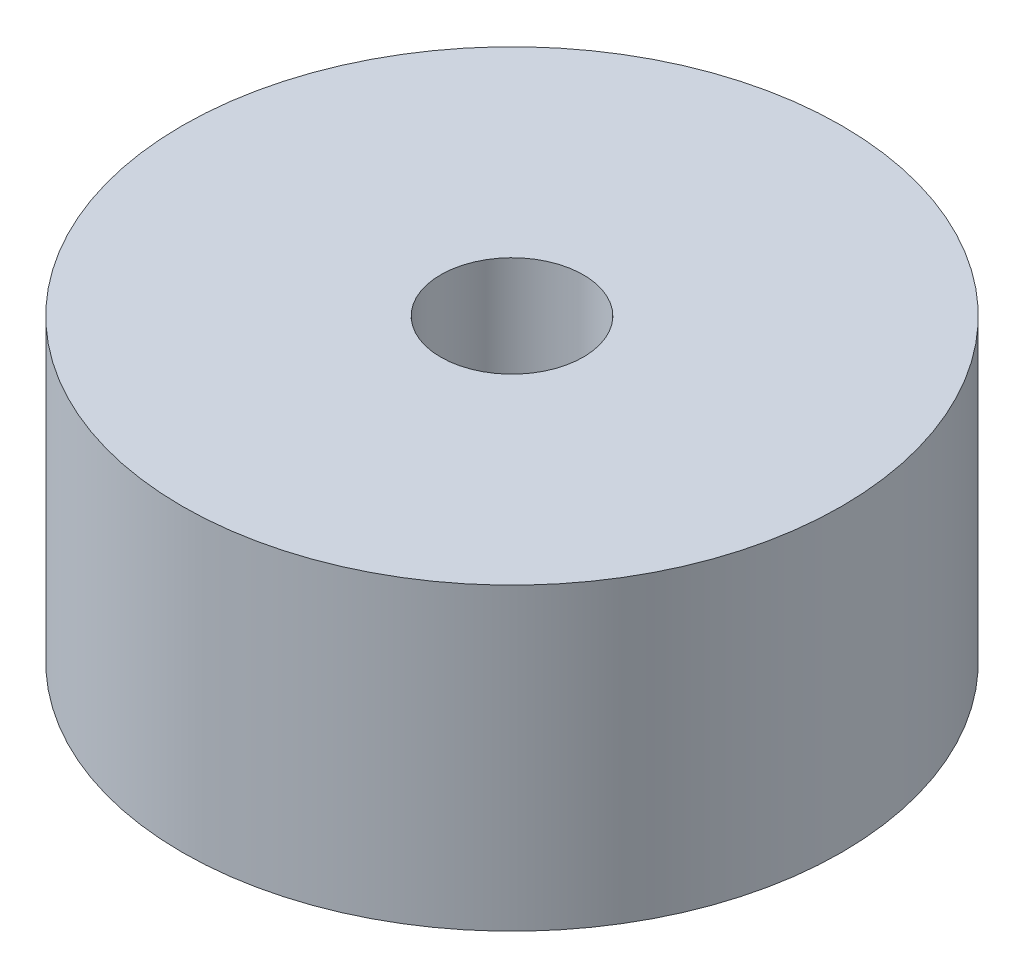
ISO-10303-21;
HEADER;
FILE_DESCRIPTION(('STEP AP214'),'2;1');
FILE_NAME('part.step','',(''),(''),'','','');
FILE_SCHEMA(('AUTOMOTIVE_DESIGN { 1 0 10303 214 1 1 1 1 }'));
ENDSEC;
DATA;
#1=APPLICATION_CONTEXT('core data for automotive mechanical design processes');
#2=APPLICATION_PROTOCOL_DEFINITION('international standard','automotive_design',2000,#1);
#3=PRODUCT_CONTEXT('',#1,'mechanical');
#4=PRODUCT('Part','Part','',(#3));
#5=PRODUCT_RELATED_PRODUCT_CATEGORY('part','',(#4));
#6=PRODUCT_DEFINITION_FORMATION('','',#4);
#7=PRODUCT_DEFINITION_CONTEXT('part definition',#1,'design');
#8=PRODUCT_DEFINITION('design','',#6,#7);
#9=PRODUCT_DEFINITION_SHAPE('','',#8);
#10=(LENGTH_UNIT() NAMED_UNIT(*) SI_UNIT(.MILLI.,.METRE.));
#11=(NAMED_UNIT(*) PLANE_ANGLE_UNIT() SI_UNIT($,.RADIAN.));
#12=(NAMED_UNIT(*) SI_UNIT($,.STERADIAN.) SOLID_ANGLE_UNIT());
#13=UNCERTAINTY_MEASURE_WITH_UNIT(LENGTH_MEASURE(1.E-05),#10,'distance_accuracy_value','');
#14=(GEOMETRIC_REPRESENTATION_CONTEXT(3) GLOBAL_UNCERTAINTY_ASSIGNED_CONTEXT((#13)) GLOBAL_UNIT_ASSIGNED_CONTEXT((#10,
#11,#12)) REPRESENTATION_CONTEXT('',''));
#15=CARTESIAN_POINT('',(0.,0.,0.));
#16=DIRECTION('',(0.,0.,1.));
#17=DIRECTION('',(1.,0.,0.));
#18=AXIS2_PLACEMENT_3D('',#15,#16,#17);
#19=CARTESIAN_POINT('',(0.,5.,0.));
#20=DIRECTION('',(0.,1.,0.));
#21=DIRECTION('',(0.,0.,1.));
#22=AXIS2_PLACEMENT_3D('',#19,#20,#21);
#23=PLANE('',#22);
#24=CARTESIAN_POINT('',(0.,5.,0.));
#25=DIRECTION('',(0.,1.,0.));
#26=DIRECTION('',(0.,0.,1.));
#27=AXIS2_PLACEMENT_3D('',#24,#25,#26);
#28=CIRCLE('',#27,5.5);
#29=CARTESIAN_POINT('',(0.,5.,5.5));
#30=VERTEX_POINT('',#29);
#31=EDGE_CURVE('E10',#30,#30,#28,.T.);
#32=ORIENTED_EDGE('',*,*,#31,.T.);
#33=EDGE_LOOP('',(#32));
#34=FACE_BOUND('',#33,.T.);
#35=CARTESIAN_POINT('',(0.,5.,0.));
#36=DIRECTION('',(0.,1.,0.));
#37=DIRECTION('',(0.,0.,1.));
#38=AXIS2_PLACEMENT_3D('',#35,#36,#37);
#39=CIRCLE('',#38,1.19);
#40=CARTESIAN_POINT('',(0.,5.,1.19));
#41=VERTEX_POINT('',#40);
#42=EDGE_CURVE('E42',#41,#41,#39,.T.);
#43=ORIENTED_EDGE('',*,*,#42,.F.);
#44=EDGE_LOOP('',(#43));
#45=FACE_BOUND('',#44,.T.);
#46=ADVANCED_FACE('F31',(#34,#45),#23,.T.);
#47=CARTESIAN_POINT('',(0.,0.,0.));
#48=DIRECTION('',(0.,1.,0.));
#49=DIRECTION('',(0.,0.,1.));
#50=AXIS2_PLACEMENT_3D('',#47,#48,#49);
#51=PLANE('',#50);
#52=CARTESIAN_POINT('',(0.,0.,0.));
#53=DIRECTION('',(0.,1.,0.));
#54=DIRECTION('',(0.,0.,1.));
#55=AXIS2_PLACEMENT_3D('',#52,#53,#54);
#56=CIRCLE('',#55,5.5);
#57=CARTESIAN_POINT('',(0.,0.,5.5));
#58=VERTEX_POINT('',#57);
#59=EDGE_CURVE('E35',#58,#58,#56,.T.);
#60=ORIENTED_EDGE('',*,*,#59,.F.);
#61=EDGE_LOOP('',(#60));
#62=FACE_BOUND('',#61,.T.);
#63=CARTESIAN_POINT('',(0.,0.,0.));
#64=DIRECTION('',(0.,1.,0.));
#65=DIRECTION('',(0.,0.,1.));
#66=AXIS2_PLACEMENT_3D('',#63,#64,#65);
#67=CIRCLE('',#66,1.19);
#68=CARTESIAN_POINT('',(0.,0.,1.19));
#69=VERTEX_POINT('',#68);
#70=EDGE_CURVE('E44',#69,#69,#67,.T.);
#71=ORIENTED_EDGE('',*,*,#70,.T.);
#72=EDGE_LOOP('',(#71));
#73=FACE_BOUND('',#72,.T.);
#74=ADVANCED_FACE('F54',(#62,#73),#51,.F.);
#75=CARTESIAN_POINT('',(0.,5.,0.));
#76=DIRECTION('',(0.,-1.,0.));
#77=DIRECTION('',(0.,0.,-1.));
#78=AXIS2_PLACEMENT_3D('',#75,#76,#77);
#79=CYLINDRICAL_SURFACE('',#78,5.5);
#80=ORIENTED_EDGE('',*,*,#31,.F.);
#81=EDGE_LOOP('',(#80));
#82=FACE_BOUND('',#81,.T.);
#83=ORIENTED_EDGE('',*,*,#59,.T.);
#84=EDGE_LOOP('',(#83));
#85=FACE_BOUND('',#84,.T.);
#86=ADVANCED_FACE('F33',(#82,#85),#79,.T.);
#87=CARTESIAN_POINT('',(0.,5.,0.));
#88=DIRECTION('',(0.,-1.,0.));
#89=DIRECTION('',(0.,0.,-1.));
#90=AXIS2_PLACEMENT_3D('',#87,#88,#89);
#91=CYLINDRICAL_SURFACE('',#90,1.19);
#92=ORIENTED_EDGE('',*,*,#42,.T.);
#93=EDGE_LOOP('',(#92));
#94=FACE_BOUND('',#93,.T.);
#95=ORIENTED_EDGE('',*,*,#70,.F.);
#96=EDGE_LOOP('',(#95));
#97=FACE_BOUND('',#96,.T.);
#98=ADVANCED_FACE('F50',(#94,#97),#91,.F.);
#99=CLOSED_SHELL('',(#46,#74,#86,#98));
#100=MANIFOLD_SOLID_BREP('B2',#99);
#101=ADVANCED_BREP_SHAPE_REPRESENTATION('',(#18,#100),#14);
#102=SHAPE_DEFINITION_REPRESENTATION(#9,#101);
ENDSEC;
END-ISO-10303-21;
